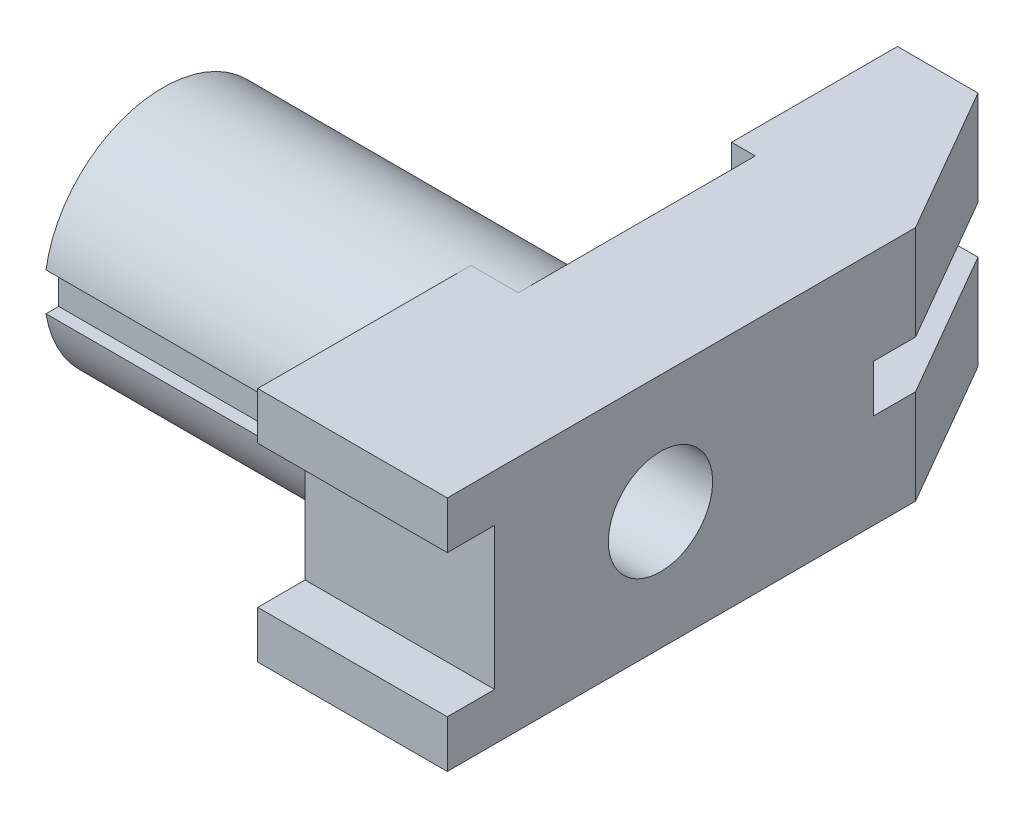
ISO-10303-21;
HEADER;
FILE_DESCRIPTION(('STEP AP214'),'2;1');
FILE_NAME('part.step','',(''),(''),'','','');
FILE_SCHEMA(('AUTOMOTIVE_DESIGN { 1 0 10303 214 1 1 1 1 }'));
ENDSEC;
DATA;
#1=APPLICATION_CONTEXT('core data for automotive mechanical design processes');
#2=APPLICATION_PROTOCOL_DEFINITION('international standard','automotive_design',2000,#1);
#3=PRODUCT_CONTEXT('',#1,'mechanical');
#4=PRODUCT('Part','Part','',(#3));
#5=PRODUCT_RELATED_PRODUCT_CATEGORY('part','',(#4));
#6=PRODUCT_DEFINITION_FORMATION('','',#4);
#7=PRODUCT_DEFINITION_CONTEXT('part definition',#1,'design');
#8=PRODUCT_DEFINITION('design','',#6,#7);
#9=PRODUCT_DEFINITION_SHAPE('','',#8);
#10=(LENGTH_UNIT() NAMED_UNIT(*) SI_UNIT(.MILLI.,.METRE.));
#11=(NAMED_UNIT(*) PLANE_ANGLE_UNIT() SI_UNIT($,.RADIAN.));
#12=(NAMED_UNIT(*) SI_UNIT($,.STERADIAN.) SOLID_ANGLE_UNIT());
#13=UNCERTAINTY_MEASURE_WITH_UNIT(LENGTH_MEASURE(1.E-05),#10,'distance_accuracy_value','');
#14=(GEOMETRIC_REPRESENTATION_CONTEXT(3) GLOBAL_UNCERTAINTY_ASSIGNED_CONTEXT((#13)) GLOBAL_UNIT_ASSIGNED_CONTEXT((#10,
#11,#12)) REPRESENTATION_CONTEXT('',''));
#15=CARTESIAN_POINT('',(0.,0.,0.));
#16=DIRECTION('',(0.,0.,1.));
#17=DIRECTION('',(1.,0.,0.));
#18=AXIS2_PLACEMENT_3D('',#15,#16,#17);
#19=CARTESIAN_POINT('',(-105.,25.0000000000001,-70.));
#20=DIRECTION('',(1.,0.,0.));
#21=DIRECTION('',(0.,0.,-1.));
#22=AXIS2_PLACEMENT_3D('',#19,#20,#21);
#23=PLANE('',#22);
#24=CARTESIAN_POINT('',(-105.,0.,-45.));
#25=DIRECTION('',(-1.,0.,0.));
#26=DIRECTION('',(0.,0.,1.));
#27=AXIS2_PLACEMENT_3D('',#24,#25,#26);
#28=CIRCLE('',#27,18.);
#29=CARTESIAN_POINT('',(-105.,0.,-27.));
#30=VERTEX_POINT('',#29);
#31=EDGE_CURVE('E785',#30,#30,#28,.T.);
#32=ORIENTED_EDGE('',*,*,#31,.F.);
#33=EDGE_LOOP('',(#32));
#34=FACE_BOUND('',#33,.T.);
#35=DIRECTION('',(0.,0.,-1.));
#36=VECTOR('',#35,1.);
#37=CARTESIAN_POINT('',(-105.,-4.00000000000001,0.));
#38=LINE('',#37,#36);
#39=CARTESIAN_POINT('',(-105.,-4.00000000000001,-20.3220746414939));
#40=VERTEX_POINT('',#39);
#41=CARTESIAN_POINT('',(-105.,-4.00000000000001,-23.));
#42=VERTEX_POINT('',#41);
#43=EDGE_CURVE('E248',#40,#42,#38,.T.);
#44=ORIENTED_EDGE('',*,*,#43,.T.);
#45=DIRECTION('',(0.,1.,0.));
#46=VECTOR('',#45,1.);
#47=CARTESIAN_POINT('',(-105.,-4.00000000000001,-23.));
#48=LINE('',#47,#46);
#49=CARTESIAN_POINT('',(-105.,4.00000000000001,-23.));
#50=VERTEX_POINT('',#49);
#51=EDGE_CURVE('E247',#42,#50,#48,.T.);
#52=ORIENTED_EDGE('',*,*,#51,.T.);
#53=DIRECTION('',(0.,0.,-1.));
#54=VECTOR('',#53,1.);
#55=CARTESIAN_POINT('',(-105.,4.00000000000001,0.));
#56=LINE('',#55,#54);
#57=CARTESIAN_POINT('',(-105.,4.00000000000001,-20.3220746414939));
#58=VERTEX_POINT('',#57);
#59=EDGE_CURVE('E239',#58,#50,#56,.T.);
#60=ORIENTED_EDGE('',*,*,#59,.F.);
#61=CARTESIAN_POINT('',(-105.,0.,-45.));
#62=DIRECTION('',(-1.,0.,0.));
#63=DIRECTION('',(0.,0.,1.));
#64=AXIS2_PLACEMENT_3D('',#61,#62,#63);
#65=CIRCLE('',#64,25.);
#66=EDGE_CURVE('E262',#58,#40,#65,.T.);
#67=ORIENTED_EDGE('',*,*,#66,.T.);
#68=EDGE_LOOP('',(#44,#52,#60,#67));
#69=FACE_BOUND('',#68,.T.);
#70=ADVANCED_FACE('F70',(#34,#69),#23,.F.);
#71=CARTESIAN_POINT('',(-30.,0.,-45.));
#72=DIRECTION('',(-1.,0.,0.));
#73=DIRECTION('',(0.,0.,1.));
#74=AXIS2_PLACEMENT_3D('',#71,#72,#73);
#75=CYLINDRICAL_SURFACE('',#74,25.);
#76=CARTESIAN_POINT('',(-40.,0.,-45.));
#77=DIRECTION('',(-1.,0.,0.));
#78=DIRECTION('',(0.,0.,1.));
#79=AXIS2_PLACEMENT_3D('',#76,#77,#78);
#80=CIRCLE('',#79,25.);
#81=CARTESIAN_POINT('',(-40.,-25.0000000000001,-45.));
#82=VERTEX_POINT('',#81);
#83=CARTESIAN_POINT('',(-40.,25.0000000000001,-45.));
#84=VERTEX_POINT('',#83);
#85=EDGE_CURVE('E252',#82,#84,#80,.T.);
#86=ORIENTED_EDGE('',*,*,#85,.T.);
#87=DIRECTION('',(-1.,0.,0.));
#88=VECTOR('',#87,1.);
#89=CARTESIAN_POINT('',(-30.,25.0000000000001,-45.));
#90=LINE('',#89,#88);
#91=CARTESIAN_POINT('',(-30.,25.0000000000001,-45.));
#92=VERTEX_POINT('',#91);
#93=EDGE_CURVE('E259',#92,#84,#90,.T.);
#94=ORIENTED_EDGE('',*,*,#93,.F.);
#95=CARTESIAN_POINT('',(-30.,0.,-45.));
#96=DIRECTION('',(-1.,0.,0.));
#97=DIRECTION('',(0.,0.,1.));
#98=AXIS2_PLACEMENT_3D('',#95,#96,#97);
#99=CIRCLE('',#98,25.);
#100=CARTESIAN_POINT('',(-30.,-25.0000000000001,-45.));
#101=VERTEX_POINT('',#100);
#102=EDGE_CURVE('E263',#92,#101,#99,.T.);
#103=ORIENTED_EDGE('',*,*,#102,.T.);
#104=DIRECTION('',(-1.,0.,0.));
#105=VECTOR('',#104,1.);
#106=CARTESIAN_POINT('',(-30.,-25.0000000000001,-45.));
#107=LINE('',#106,#105);
#108=EDGE_CURVE('E266',#101,#82,#107,.T.);
#109=ORIENTED_EDGE('',*,*,#108,.T.);
#110=EDGE_LOOP('',(#86,#94,#103,#109));
#111=FACE_BOUND('',#110,.T.);
#112=CARTESIAN_POINT('',(-48.1891833863778,-4.00000000000001,-20.3220746414939));
#113=CARTESIAN_POINT('',(-48.153061047939,-3.79263472747698,-20.2884587504304));
#114=CARTESIAN_POINT('',(-48.1201668566307,-3.58430736478111,-20.2573780464081));
#115=CARTESIAN_POINT('',(-48.0605427771464,-3.16608452499109,-20.2003954256627));
#116=CARTESIAN_POINT('',(-48.0338123857564,-2.95618917735305,-20.1744930861997));
#117=CARTESIAN_POINT('',(-47.9862181729804,-2.53515300017993,-20.1279701429585));
#118=CARTESIAN_POINT('',(-47.9653543363235,-2.32401217388836,-20.1073495254317));
#119=CARTESIAN_POINT('',(-47.9292800029746,-1.90080143650091,-20.0714607059728));
#120=CARTESIAN_POINT('',(-47.9140696500622,-1.68873150191466,-20.0561926401675));
#121=CARTESIAN_POINT('',(-47.8770690069398,-1.05850640747543,-20.018914778113));
#122=CARTESIAN_POINT('',(-47.8631393055396,-0.639374265330873,-20.0046630826135));
#123=CARTESIAN_POINT('',(-47.8559041205962,0.199104322464576,-19.9972753316197));
#124=CARTESIAN_POINT('',(-47.8625950258473,0.618450717734509,-20.0041355788739));
#125=CARTESIAN_POINT('',(-47.9000419624336,1.53337433769471,-20.0421295341584));
#126=CARTESIAN_POINT('',(-47.9350410788579,2.02862851604135,-20.0775392085342));
#127=CARTESIAN_POINT('',(-48.0113080321655,2.769148940734,-20.1525797385717));
#128=CARTESIAN_POINT('',(-48.0408958018128,3.01680138208284,-20.1814435177569));
#129=CARTESIAN_POINT('',(-48.108555481816,3.51006893435837,-20.2463872348163));
#130=CARTESIAN_POINT('',(-48.1466300161683,3.75568339075267,-20.2824694041676));
#131=CARTESIAN_POINT('',(-48.1891833863777,4.00000000000001,-20.3220746414939));
#132=B_SPLINE_CURVE_WITH_KNOTS('',3,(#112,#113,#114,#115,#116,#117,#118,#119,#120,#121,#122,
#123,#124,#125,#126,#127,#128,#129,#130,#131),.UNSPECIFIED.,.F.,.F.,(4,2,2,2,2,2,2,2,2,4),(0.,
0.639407778744696,1.27876333759013,1.9181172321481,2.55748738567127,3.81513840207781,
5.0725691835372,6.56379177154527,7.31680844559122,8.07005826627208),.UNSPECIFIED.);
#133=CARTESIAN_POINT('',(-48.1891833863778,-4.00000000000001,-20.3220746414939));
#134=VERTEX_POINT('',#133);
#135=CARTESIAN_POINT('',(-48.1891833863778,4.00000000000001,-20.3220746414939));
#136=VERTEX_POINT('',#135);
#137=EDGE_CURVE('E78',#134,#136,#132,.T.);
#138=ORIENTED_EDGE('',*,*,#137,.F.);
#139=DIRECTION('',(-1.,0.,0.));
#140=VECTOR('',#139,1.);
#141=CARTESIAN_POINT('',(-29.9999999999999,-4.00000000000001,-20.3220746414939));
#142=LINE('',#141,#140);
#143=EDGE_CURVE('E12',#134,#40,#142,.T.);
#144=ORIENTED_EDGE('',*,*,#143,.T.);
#145=ORIENTED_EDGE('',*,*,#66,.F.);
#146=DIRECTION('',(-1.,0.,0.));
#147=VECTOR('',#146,1.);
#148=CARTESIAN_POINT('',(-29.9999999999999,4.00000000000001,-20.3220746414939));
#149=LINE('',#148,#147);
#150=EDGE_CURVE('E398',#136,#58,#149,.T.);
#151=ORIENTED_EDGE('',*,*,#150,.F.);
#152=EDGE_LOOP('',(#138,#144,#145,#151));
#153=FACE_BOUND('',#152,.T.);
#154=ADVANCED_FACE('F404',(#111,#153),#75,.T.);
#155=CARTESIAN_POINT('',(0.,25.0000000000001,0.));
#156=DIRECTION('',(0.,1.,0.));
#157=DIRECTION('',(0.,0.,1.));
#158=AXIS2_PLACEMENT_3D('',#155,#156,#157);
#159=PLANE('',#158);
#160=ORIENTED_EDGE('',*,*,#93,.T.);
#161=DIRECTION('',(0.,0.,1.));
#162=VECTOR('',#161,1.);
#163=CARTESIAN_POINT('',(-40.,25.0000000000001,-20.));
#164=LINE('',#163,#162);
#165=CARTESIAN_POINT('',(-40.,25.0000000000001,0.));
#166=VERTEX_POINT('',#165);
#167=EDGE_CURVE('E347',#84,#166,#164,.T.);
#168=ORIENTED_EDGE('',*,*,#167,.T.);
#169=DIRECTION('',(1.,0.,0.));
#170=VECTOR('',#169,1.);
#171=CARTESIAN_POINT('',(-40.,25.0000000000001,0.));
#172=LINE('',#171,#170);
#173=CARTESIAN_POINT('',(0.,25.0000000000001,0.));
#174=VERTEX_POINT('',#173);
#175=EDGE_CURVE('E331',#166,#174,#172,.T.);
#176=ORIENTED_EDGE('',*,*,#175,.T.);
#177=DIRECTION('',(0.,0.,-1.));
#178=VECTOR('',#177,1.);
#179=CARTESIAN_POINT('',(0.,25.0000000000001,0.));
#180=LINE('',#179,#178);
#181=CARTESIAN_POINT('',(0.,25.0000000000001,-98.8230854637603));
#182=VERTEX_POINT('',#181);
#183=EDGE_CURVE('E334',#174,#182,#180,.T.);
#184=ORIENTED_EDGE('',*,*,#183,.T.);
#185=DIRECTION('',(-0.500000000000001,0.,-0.866025403784438));
#186=VECTOR('',#185,1.);
#187=CARTESIAN_POINT('',(0.,25.0000000000001,-98.8230854637603));
#188=LINE('',#187,#186);
#189=CARTESIAN_POINT('',(-18.,25.0000000000001,-130.));
#190=VERTEX_POINT('',#189);
#191=EDGE_CURVE('E337',#182,#190,#188,.T.);
#192=ORIENTED_EDGE('',*,*,#191,.T.);
#193=DIRECTION('',(-1.,0.,0.));
#194=VECTOR('',#193,1.);
#195=CARTESIAN_POINT('',(-18.,25.0000000000001,-130.));
#196=LINE('',#195,#194);
#197=CARTESIAN_POINT('',(-35.,25.0000000000001,-130.));
#198=VERTEX_POINT('',#197);
#199=EDGE_CURVE('E339',#190,#198,#196,.T.);
#200=ORIENTED_EDGE('',*,*,#199,.T.);
#201=DIRECTION('',(0.,0.,1.));
#202=VECTOR('',#201,1.);
#203=CARTESIAN_POINT('',(-35.,25.0000000000001,-130.));
#204=LINE('',#203,#202);
#205=CARTESIAN_POINT('',(-35.,25.0000000000001,-95.));
#206=VERTEX_POINT('',#205);
#207=EDGE_CURVE('E341',#198,#206,#204,.T.);
#208=ORIENTED_EDGE('',*,*,#207,.T.);
#209=DIRECTION('',(1.,0.,0.));
#210=VECTOR('',#209,1.);
#211=CARTESIAN_POINT('',(-35.,25.0000000000001,-95.));
#212=LINE('',#211,#210);
#213=CARTESIAN_POINT('',(-30.,25.0000000000001,-95.0000000000001));
#214=VERTEX_POINT('',#213);
#215=EDGE_CURVE('E343',#206,#214,#212,.T.);
#216=ORIENTED_EDGE('',*,*,#215,.T.);
#217=DIRECTION('',(0.,0.,1.));
#218=VECTOR('',#217,1.);
#219=CARTESIAN_POINT('',(-30.,25.0000000000001,-95.0000000000001));
#220=LINE('',#219,#218);
#221=EDGE_CURVE('E345',#214,#92,#220,.T.);
#222=ORIENTED_EDGE('',*,*,#221,.T.);
#223=EDGE_LOOP('',(#160,#168,#176,#184,#192,#200,#208,#216,#222));
#224=FACE_BOUND('',#223,.T.);
#225=ADVANCED_FACE('F439',(#224),#159,.T.);
#226=CARTESIAN_POINT('',(0.,-25.0000000000001,0.));
#227=DIRECTION('',(0.,1.,0.));
#228=DIRECTION('',(0.,0.,1.));
#229=AXIS2_PLACEMENT_3D('',#226,#227,#228);
#230=PLANE('',#229);
#231=DIRECTION('',(0.,0.,1.));
#232=VECTOR('',#231,1.);
#233=CARTESIAN_POINT('',(-40.,-25.0000000000001,-20.));
#234=LINE('',#233,#232);
#235=CARTESIAN_POINT('',(-40.,-25.0000000000001,0.));
#236=VERTEX_POINT('',#235);
#237=EDGE_CURVE('E335',#82,#236,#234,.T.);
#238=ORIENTED_EDGE('',*,*,#237,.F.);
#239=ORIENTED_EDGE('',*,*,#108,.F.);
#240=DIRECTION('',(0.,0.,1.));
#241=VECTOR('',#240,1.);
#242=CARTESIAN_POINT('',(-30.,-25.0000000000001,-89.5244773048154));
#243=LINE('',#242,#241);
#244=CARTESIAN_POINT('',(-30.,-25.0000000000001,-95.0000000000001));
#245=VERTEX_POINT('',#244);
#246=EDGE_CURVE('E367',#245,#101,#243,.T.);
#247=ORIENTED_EDGE('',*,*,#246,.F.);
#248=DIRECTION('',(1.,0.,0.));
#249=VECTOR('',#248,1.);
#250=CARTESIAN_POINT('',(-35.,-25.0000000000001,-95.));
#251=LINE('',#250,#249);
#252=CARTESIAN_POINT('',(-35.,-25.0000000000001,-95.));
#253=VERTEX_POINT('',#252);
#254=EDGE_CURVE('E364',#253,#245,#251,.T.);
#255=ORIENTED_EDGE('',*,*,#254,.F.);
#256=DIRECTION('',(0.,0.,1.));
#257=VECTOR('',#256,1.);
#258=CARTESIAN_POINT('',(-35.,-25.0000000000001,-130.));
#259=LINE('',#258,#257);
#260=CARTESIAN_POINT('',(-35.,-25.0000000000001,-130.));
#261=VERTEX_POINT('',#260);
#262=EDGE_CURVE('E361',#261,#253,#259,.T.);
#263=ORIENTED_EDGE('',*,*,#262,.F.);
#264=DIRECTION('',(-1.,0.,0.));
#265=VECTOR('',#264,1.);
#266=CARTESIAN_POINT('',(-18.,-25.0000000000001,-130.));
#267=LINE('',#266,#265);
#268=CARTESIAN_POINT('',(-18.,-25.0000000000001,-130.));
#269=VERTEX_POINT('',#268);
#270=EDGE_CURVE('E358',#269,#261,#267,.T.);
#271=ORIENTED_EDGE('',*,*,#270,.F.);
#272=DIRECTION('',(-0.500000000000001,0.,-0.866025403784438));
#273=VECTOR('',#272,1.);
#274=CARTESIAN_POINT('',(0.,-25.0000000000001,-98.8230854637603));
#275=LINE('',#274,#273);
#276=CARTESIAN_POINT('',(0.,-25.0000000000001,-98.8230854637603));
#277=VERTEX_POINT('',#276);
#278=EDGE_CURVE('E355',#277,#269,#275,.T.);
#279=ORIENTED_EDGE('',*,*,#278,.F.);
#280=DIRECTION('',(0.,0.,-1.));
#281=VECTOR('',#280,1.);
#282=CARTESIAN_POINT('',(0.,-25.0000000000001,0.));
#283=LINE('',#282,#281);
#284=CARTESIAN_POINT('',(0.,-25.0000000000001,0.));
#285=VERTEX_POINT('',#284);
#286=EDGE_CURVE('E352',#285,#277,#283,.T.);
#287=ORIENTED_EDGE('',*,*,#286,.F.);
#288=DIRECTION('',(1.,0.,0.));
#289=VECTOR('',#288,1.);
#290=CARTESIAN_POINT('',(-40.,-25.0000000000001,0.));
#291=LINE('',#290,#289);
#292=EDGE_CURVE('E330',#236,#285,#291,.T.);
#293=ORIENTED_EDGE('',*,*,#292,.F.);
#294=EDGE_LOOP('',(#238,#239,#247,#255,#263,#271,#279,#287,#293));
#295=FACE_BOUND('',#294,.T.);
#296=ADVANCED_FACE('F504',(#295),#230,.F.);
#297=CARTESIAN_POINT('',(-40.,25.0000000000001,0.));
#298=DIRECTION('',(0.,0.,-1.));
#299=DIRECTION('',(-1.,0.,0.));
#300=AXIS2_PLACEMENT_3D('',#297,#298,#299);
#301=PLANE('',#300);
#302=DIRECTION('',(0.,-1.,0.));
#303=VECTOR('',#302,1.);
#304=CARTESIAN_POINT('',(-40.,25.0000000000001,0.));
#305=LINE('',#304,#303);
#306=CARTESIAN_POINT('',(-40.,15.0000000000001,0.));
#307=VERTEX_POINT('',#306);
#308=EDGE_CURVE('E371',#166,#307,#305,.T.);
#309=ORIENTED_EDGE('',*,*,#308,.T.);
#310=DIRECTION('',(1.,0.,0.));
#311=VECTOR('',#310,1.);
#312=CARTESIAN_POINT('',(-105.001,15.0000000000001,0.));
#313=LINE('',#312,#311);
#314=CARTESIAN_POINT('',(0.,15.,0.));
#315=VERTEX_POINT('',#314);
#316=EDGE_CURVE('E284',#307,#315,#313,.T.);
#317=ORIENTED_EDGE('',*,*,#316,.T.);
#318=DIRECTION('',(0.,-1.,0.));
#319=VECTOR('',#318,1.);
#320=CARTESIAN_POINT('',(0.,25.0000000000001,0.));
#321=LINE('',#320,#319);
#322=EDGE_CURVE('E395',#174,#315,#321,.T.);
#323=ORIENTED_EDGE('',*,*,#322,.F.);
#324=ORIENTED_EDGE('',*,*,#175,.F.);
#325=EDGE_LOOP('',(#309,#317,#323,#324));
#326=FACE_BOUND('',#325,.T.);
#327=ADVANCED_FACE('F477',(#326),#301,.F.);
#328=CARTESIAN_POINT('',(0.,25.0000000000001,-98.8230854637603));
#329=DIRECTION('',(-0.866025403784438,0.,0.500000000000001));
#330=DIRECTION('',(0.500000000000001,0.,0.866025403784438));
#331=AXIS2_PLACEMENT_3D('',#328,#329,#330);
#332=PLANE('',#331);
#333=DIRECTION('',(0.,-1.,0.));
#334=VECTOR('',#333,1.);
#335=CARTESIAN_POINT('',(-18.,25.0000000000001,-130.));
#336=LINE('',#335,#334);
#337=CARTESIAN_POINT('',(-18.,-5.00000000000002,-130.));
#338=VERTEX_POINT('',#337);
#339=EDGE_CURVE('E386',#338,#269,#336,.T.);
#340=ORIENTED_EDGE('',*,*,#339,.F.);
#341=DIRECTION('',(-0.500000000000001,0.,-0.866025403784438));
#342=VECTOR('',#341,1.);
#343=CARTESIAN_POINT('',(-22.4297419243113,-5.00000000000001,-137.672538077325));
#344=LINE('',#343,#342);
#345=CARTESIAN_POINT('',(0.,-5.00000000000002,-98.8230854637603));
#346=VERTEX_POINT('',#345);
#347=EDGE_CURVE('E296',#346,#338,#344,.T.);
#348=ORIENTED_EDGE('',*,*,#347,.F.);
#349=DIRECTION('',(0.,-1.,0.));
#350=VECTOR('',#349,1.);
#351=CARTESIAN_POINT('',(0.,25.0000000000001,-98.8230854637603));
#352=LINE('',#351,#350);
#353=EDGE_CURVE('E390',#346,#277,#352,.T.);
#354=ORIENTED_EDGE('',*,*,#353,.T.);
#355=ORIENTED_EDGE('',*,*,#278,.T.);
#356=EDGE_LOOP('',(#340,#348,#354,#355));
#357=FACE_BOUND('',#356,.T.);
#358=ADVANCED_FACE('F470',(#357),#332,.F.);
#359=CARTESIAN_POINT('',(-18.,25.0000000000001,-130.));
#360=DIRECTION('',(0.,0.,1.));
#361=DIRECTION('',(1.,0.,0.));
#362=AXIS2_PLACEMENT_3D('',#359,#360,#361);
#363=PLANE('',#362);
#364=DIRECTION('',(0.,-1.,0.));
#365=VECTOR('',#364,1.);
#366=CARTESIAN_POINT('',(-35.,25.0000000000001,-130.));
#367=LINE('',#366,#365);
#368=CARTESIAN_POINT('',(-35.,-5.00000000000002,-130.));
#369=VERTEX_POINT('',#368);
#370=EDGE_CURVE('E382',#369,#261,#367,.T.);
#371=ORIENTED_EDGE('',*,*,#370,.F.);
#372=DIRECTION('',(1.,0.,0.));
#373=VECTOR('',#372,1.);
#374=CARTESIAN_POINT('',(-105.001,-5.00000000000001,-130.));
#375=LINE('',#374,#373);
#376=EDGE_CURVE('E316',#369,#338,#375,.T.);
#377=ORIENTED_EDGE('',*,*,#376,.T.);
#378=ORIENTED_EDGE('',*,*,#339,.T.);
#379=ORIENTED_EDGE('',*,*,#270,.T.);
#380=EDGE_LOOP('',(#371,#377,#378,#379));
#381=FACE_BOUND('',#380,.T.);
#382=ADVANCED_FACE('F466',(#381),#363,.F.);
#383=CARTESIAN_POINT('',(-35.,25.0000000000001,-130.));
#384=DIRECTION('',(1.,0.,0.));
#385=DIRECTION('',(0.,0.,-1.));
#386=AXIS2_PLACEMENT_3D('',#383,#384,#385);
#387=PLANE('',#386);
#388=DIRECTION('',(0.,-1.,0.));
#389=VECTOR('',#388,1.);
#390=CARTESIAN_POINT('',(-35.,25.0000000000001,-95.));
#391=LINE('',#390,#389);
#392=CARTESIAN_POINT('',(-35.,-5.00000000000002,-95.));
#393=VERTEX_POINT('',#392);
#394=EDGE_CURVE('E378',#393,#253,#391,.T.);
#395=ORIENTED_EDGE('',*,*,#394,.F.);
#396=DIRECTION('',(0.,0.,1.));
#397=VECTOR('',#396,1.);
#398=CARTESIAN_POINT('',(-35.,-5.00000000000002,-90.));
#399=LINE('',#398,#397);
#400=EDGE_CURVE('E305',#369,#393,#399,.T.);
#401=ORIENTED_EDGE('',*,*,#400,.F.);
#402=ORIENTED_EDGE('',*,*,#370,.T.);
#403=ORIENTED_EDGE('',*,*,#262,.T.);
#404=EDGE_LOOP('',(#395,#401,#402,#403));
#405=FACE_BOUND('',#404,.T.);
#406=ADVANCED_FACE('F461',(#405),#387,.F.);
#407=CARTESIAN_POINT('',(-35.,25.0000000000001,-95.));
#408=DIRECTION('',(0.,0.,-1.));
#409=DIRECTION('',(-1.,0.,0.));
#410=AXIS2_PLACEMENT_3D('',#407,#408,#409);
#411=PLANE('',#410);
#412=DIRECTION('',(0.,-1.,0.));
#413=VECTOR('',#412,1.);
#414=CARTESIAN_POINT('',(-30.,25.0000000000001,-95.0000000000001));
#415=LINE('',#414,#413);
#416=CARTESIAN_POINT('',(-30.,-5.00000000000001,-95.0000000000001));
#417=VERTEX_POINT('',#416);
#418=EDGE_CURVE('E374',#417,#245,#415,.T.);
#419=ORIENTED_EDGE('',*,*,#418,.F.);
#420=DIRECTION('',(1.,0.,0.));
#421=VECTOR('',#420,1.);
#422=CARTESIAN_POINT('',(-105.001,-5.00000000000001,-95.));
#423=LINE('',#422,#421);
#424=EDGE_CURVE('E303',#393,#417,#423,.T.);
#425=ORIENTED_EDGE('',*,*,#424,.F.);
#426=ORIENTED_EDGE('',*,*,#394,.T.);
#427=ORIENTED_EDGE('',*,*,#254,.T.);
#428=EDGE_LOOP('',(#419,#425,#426,#427));
#429=FACE_BOUND('',#428,.T.);
#430=ADVANCED_FACE('F456',(#429),#411,.F.);
#431=CARTESIAN_POINT('',(0.,-15.,0.));
#432=VERTEX_POINT('',#431);
#433=EDGE_CURVE('E394',#432,#285,#321,.T.);
#434=ORIENTED_EDGE('',*,*,#433,.F.);
#435=DIRECTION('',(1.,0.,0.));
#436=VECTOR('',#435,1.);
#437=CARTESIAN_POINT('',(-105.001,-15.,0.));
#438=LINE('',#437,#436);
#439=CARTESIAN_POINT('',(-40.,-15.,0.));
#440=VERTEX_POINT('',#439);
#441=EDGE_CURVE('E283',#440,#432,#438,.T.);
#442=ORIENTED_EDGE('',*,*,#441,.F.);
#443=EDGE_CURVE('E349',#440,#236,#305,.T.);
#444=ORIENTED_EDGE('',*,*,#443,.T.);
#445=ORIENTED_EDGE('',*,*,#292,.T.);
#446=EDGE_LOOP('',(#434,#442,#444,#445));
#447=FACE_BOUND('',#446,.T.);
#448=ADVANCED_FACE('F72',(#447),#301,.F.);
#449=CARTESIAN_POINT('',(0.,25.0000000000001,0.));
#450=DIRECTION('',(-1.,0.,0.));
#451=DIRECTION('',(0.,0.,1.));
#452=AXIS2_PLACEMENT_3D('',#449,#450,#451);
#453=PLANE('',#452);
#454=CARTESIAN_POINT('',(0.,0.,-45.));
#455=DIRECTION('',(-1.,0.,0.));
#456=DIRECTION('',(0.,0.,1.));
#457=AXIS2_PLACEMENT_3D('',#454,#455,#456);
#458=CIRCLE('',#457,11.);
#459=CARTESIAN_POINT('',(0.,0.,-34.));
#460=VERTEX_POINT('',#459);
#461=EDGE_CURVE('E481',#460,#460,#458,.F.);
#462=ORIENTED_EDGE('',*,*,#461,.F.);
#463=EDGE_LOOP('',(#462));
#464=FACE_BOUND('',#463,.T.);
#465=ORIENTED_EDGE('',*,*,#322,.T.);
#466=DIRECTION('',(0.,0.,1.));
#467=VECTOR('',#466,1.);
#468=CARTESIAN_POINT('',(0.,15.0000000000001,-10.));
#469=LINE('',#468,#467);
#470=CARTESIAN_POINT('',(0.,15.0000000000001,-10.));
#471=VERTEX_POINT('',#470);
#472=EDGE_CURVE('E281',#471,#315,#469,.T.);
#473=ORIENTED_EDGE('',*,*,#472,.F.);
#474=DIRECTION('',(0.,1.,0.));
#475=VECTOR('',#474,1.);
#476=CARTESIAN_POINT('',(0.,15.0000000000001,-10.));
#477=LINE('',#476,#475);
#478=CARTESIAN_POINT('',(0.,-15.,-10.));
#479=VERTEX_POINT('',#478);
#480=EDGE_CURVE('E278',#479,#471,#477,.T.);
#481=ORIENTED_EDGE('',*,*,#480,.F.);
#482=DIRECTION('',(0.,0.,-1.));
#483=VECTOR('',#482,1.);
#484=CARTESIAN_POINT('',(0.,-15.,-10.));
#485=LINE('',#484,#483);
#486=EDGE_CURVE('E275',#432,#479,#485,.T.);
#487=ORIENTED_EDGE('',*,*,#486,.F.);
#488=ORIENTED_EDGE('',*,*,#433,.T.);
#489=ORIENTED_EDGE('',*,*,#286,.T.);
#490=ORIENTED_EDGE('',*,*,#353,.F.);
#491=DIRECTION('',(0.,0.,-1.));
#492=VECTOR('',#491,1.);
#493=CARTESIAN_POINT('',(0.,-5.00000000000002,-90.));
#494=LINE('',#493,#492);
#495=CARTESIAN_POINT('',(0.,-5.00000000000002,-90.));
#496=VERTEX_POINT('',#495);
#497=EDGE_CURVE('E313',#496,#346,#494,.T.);
#498=ORIENTED_EDGE('',*,*,#497,.F.);
#499=DIRECTION('',(0.,-1.,0.));
#500=VECTOR('',#499,1.);
#501=CARTESIAN_POINT('',(0.,5.,-90.));
#502=LINE('',#501,#500);
#503=CARTESIAN_POINT('',(0.,5.,-90.));
#504=VERTEX_POINT('',#503);
#505=EDGE_CURVE('E310',#504,#496,#502,.T.);
#506=ORIENTED_EDGE('',*,*,#505,.F.);
#507=DIRECTION('',(0.,0.,1.));
#508=VECTOR('',#507,1.);
#509=CARTESIAN_POINT('',(0.,5.,-90.));
#510=LINE('',#509,#508);
#511=CARTESIAN_POINT('',(0.,5.00000000000001,-98.8230854637603));
#512=VERTEX_POINT('',#511);
#513=EDGE_CURVE('E307',#512,#504,#510,.T.);
#514=ORIENTED_EDGE('',*,*,#513,.F.);
#515=EDGE_CURVE('E391',#182,#512,#352,.T.);
#516=ORIENTED_EDGE('',*,*,#515,.F.);
#517=ORIENTED_EDGE('',*,*,#183,.F.);
#518=EDGE_LOOP('',(#465,#473,#481,#487,#488,#489,#490,#498,#506,#514,#516,#517));
#519=FACE_BOUND('',#518,.T.);
#520=ADVANCED_FACE('F468',(#464,#519),#453,.F.);
#521=ORIENTED_EDGE('',*,*,#515,.T.);
#522=DIRECTION('',(0.500000000000001,0.,0.866025403784438));
#523=VECTOR('',#522,1.);
#524=CARTESIAN_POINT('',(-22.4297419243113,5.00000000000002,-137.672538077325));
#525=LINE('',#524,#523);
#526=CARTESIAN_POINT('',(-18.,5.00000000000001,-130.));
#527=VERTEX_POINT('',#526);
#528=EDGE_CURVE('E294',#527,#512,#525,.T.);
#529=ORIENTED_EDGE('',*,*,#528,.F.);
#530=EDGE_CURVE('E387',#190,#527,#336,.T.);
#531=ORIENTED_EDGE('',*,*,#530,.F.);
#532=ORIENTED_EDGE('',*,*,#191,.F.);
#533=EDGE_LOOP('',(#521,#529,#531,#532));
#534=FACE_BOUND('',#533,.T.);
#535=ADVANCED_FACE('F464',(#534),#332,.F.);
#536=ORIENTED_EDGE('',*,*,#530,.T.);
#537=DIRECTION('',(1.,0.,0.));
#538=VECTOR('',#537,1.);
#539=CARTESIAN_POINT('',(-105.001,5.00000000000002,-130.));
#540=LINE('',#539,#538);
#541=CARTESIAN_POINT('',(-35.,5.00000000000002,-130.));
#542=VERTEX_POINT('',#541);
#543=EDGE_CURVE('E315',#542,#527,#540,.T.);
#544=ORIENTED_EDGE('',*,*,#543,.F.);
#545=EDGE_CURVE('E383',#198,#542,#367,.T.);
#546=ORIENTED_EDGE('',*,*,#545,.F.);
#547=ORIENTED_EDGE('',*,*,#199,.F.);
#548=EDGE_LOOP('',(#536,#544,#546,#547));
#549=FACE_BOUND('',#548,.T.);
#550=ADVANCED_FACE('F459',(#549),#363,.F.);
#551=ORIENTED_EDGE('',*,*,#545,.T.);
#552=DIRECTION('',(0.,0.,-1.));
#553=VECTOR('',#552,1.);
#554=CARTESIAN_POINT('',(-35.,5.,-90.));
#555=LINE('',#554,#553);
#556=CARTESIAN_POINT('',(-35.,5.,-95.));
#557=VERTEX_POINT('',#556);
#558=EDGE_CURVE('E328',#557,#542,#555,.T.);
#559=ORIENTED_EDGE('',*,*,#558,.F.);
#560=EDGE_CURVE('E379',#206,#557,#391,.T.);
#561=ORIENTED_EDGE('',*,*,#560,.F.);
#562=ORIENTED_EDGE('',*,*,#207,.F.);
#563=EDGE_LOOP('',(#551,#559,#561,#562));
#564=FACE_BOUND('',#563,.T.);
#565=ADVANCED_FACE('F454',(#564),#387,.F.);
#566=ORIENTED_EDGE('',*,*,#560,.T.);
#567=DIRECTION('',(-1.,0.,0.));
#568=VECTOR('',#567,1.);
#569=CARTESIAN_POINT('',(-105.001,5.,-95.));
#570=LINE('',#569,#568);
#571=CARTESIAN_POINT('',(-30.,5.,-95.0000000000001));
#572=VERTEX_POINT('',#571);
#573=EDGE_CURVE('E326',#572,#557,#570,.T.);
#574=ORIENTED_EDGE('',*,*,#573,.F.);
#575=EDGE_CURVE('E375',#214,#572,#415,.T.);
#576=ORIENTED_EDGE('',*,*,#575,.F.);
#577=ORIENTED_EDGE('',*,*,#215,.F.);
#578=EDGE_LOOP('',(#566,#574,#576,#577));
#579=FACE_BOUND('',#578,.T.);
#580=ADVANCED_FACE('F450',(#579),#411,.F.);
#581=CARTESIAN_POINT('',(-29.9999999999999,25.0000000000001,-89.5244773048155));
#582=DIRECTION('',(1.,0.,0.));
#583=DIRECTION('',(0.,0.,-1.));
#584=AXIS2_PLACEMENT_3D('',#581,#582,#583);
#585=PLANE('',#584);
#586=DIRECTION('',(0.,1.,0.));
#587=VECTOR('',#586,1.);
#588=CARTESIAN_POINT('',(-30.,5.,-90.0000000000001));
#589=LINE('',#588,#587);
#590=CARTESIAN_POINT('',(-30.,-5.00000000000001,-90.0000000000001));
#591=VERTEX_POINT('',#590);
#592=CARTESIAN_POINT('',(-30.,5.,-90.0000000000001));
#593=VERTEX_POINT('',#592);
#594=EDGE_CURVE('E298',#591,#593,#589,.T.);
#595=ORIENTED_EDGE('',*,*,#594,.F.);
#596=DIRECTION('',(0.,0.,1.));
#597=VECTOR('',#596,1.);
#598=CARTESIAN_POINT('',(-30.,-5.00000000000001,-90.0000000000001));
#599=LINE('',#598,#597);
#600=EDGE_CURVE('E300',#417,#591,#599,.T.);
#601=ORIENTED_EDGE('',*,*,#600,.F.);
#602=ORIENTED_EDGE('',*,*,#418,.T.);
#603=ORIENTED_EDGE('',*,*,#246,.T.);
#604=ORIENTED_EDGE('',*,*,#102,.F.);
#605=ORIENTED_EDGE('',*,*,#221,.F.);
#606=ORIENTED_EDGE('',*,*,#575,.T.);
#607=DIRECTION('',(0.,0.,-1.));
#608=VECTOR('',#607,1.);
#609=CARTESIAN_POINT('',(-30.,5.,-90.0000000000001));
#610=LINE('',#609,#608);
#611=EDGE_CURVE('E319',#593,#572,#610,.T.);
#612=ORIENTED_EDGE('',*,*,#611,.F.);
#613=EDGE_LOOP('',(#595,#601,#602,#603,#604,#605,#606,#612));
#614=FACE_BOUND('',#613,.T.);
#615=ADVANCED_FACE('F447',(#614),#585,.F.);
#616=CARTESIAN_POINT('',(-40.,25.0000000000001,-20.));
#617=DIRECTION('',(1.,0.,0.));
#618=DIRECTION('',(0.,0.,-1.));
#619=AXIS2_PLACEMENT_3D('',#616,#617,#618);
#620=PLANE('',#619);
#621=DIRECTION('',(0.,-1.,0.));
#622=VECTOR('',#621,1.);
#623=CARTESIAN_POINT('',(-40.,15.0000000000001,-10.));
#624=LINE('',#623,#622);
#625=CARTESIAN_POINT('',(-40.,15.0000000000001,-10.));
#626=VERTEX_POINT('',#625);
#627=CARTESIAN_POINT('',(-40.,-15.,-10.));
#628=VERTEX_POINT('',#627);
#629=EDGE_CURVE('E93',#626,#628,#624,.T.);
#630=ORIENTED_EDGE('',*,*,#629,.F.);
#631=DIRECTION('',(0.,0.,-1.));
#632=VECTOR('',#631,1.);
#633=CARTESIAN_POINT('',(-40.,15.0000000000001,-10.));
#634=LINE('',#633,#632);
#635=EDGE_CURVE('E272',#307,#626,#634,.T.);
#636=ORIENTED_EDGE('',*,*,#635,.F.);
#637=ORIENTED_EDGE('',*,*,#308,.F.);
#638=ORIENTED_EDGE('',*,*,#167,.F.);
#639=ORIENTED_EDGE('',*,*,#85,.F.);
#640=ORIENTED_EDGE('',*,*,#237,.T.);
#641=ORIENTED_EDGE('',*,*,#443,.F.);
#642=DIRECTION('',(0.,0.,1.));
#643=VECTOR('',#642,1.);
#644=CARTESIAN_POINT('',(-40.,-15.,-10.));
#645=LINE('',#644,#643);
#646=EDGE_CURVE('E287',#628,#440,#645,.T.);
#647=ORIENTED_EDGE('',*,*,#646,.F.);
#648=EDGE_LOOP('',(#630,#636,#637,#638,#639,#640,#641,#647));
#649=FACE_BOUND('',#648,.T.);
#650=ADVANCED_FACE('F445',(#649),#620,.F.);
#651=CARTESIAN_POINT('',(-105.001,-5.00000000000001,-90.));
#652=DIRECTION('',(0.,-1.,0.));
#653=DIRECTION('',(0.,0.,-1.));
#654=AXIS2_PLACEMENT_3D('',#651,#652,#653);
#655=PLANE('',#654);
#656=ORIENTED_EDGE('',*,*,#347,.T.);
#657=ORIENTED_EDGE('',*,*,#376,.F.);
#658=ORIENTED_EDGE('',*,*,#400,.T.);
#659=ORIENTED_EDGE('',*,*,#424,.T.);
#660=ORIENTED_EDGE('',*,*,#600,.T.);
#661=DIRECTION('',(1.,0.,0.));
#662=VECTOR('',#661,1.);
#663=CARTESIAN_POINT('',(-105.001,-5.00000000000001,-90.));
#664=LINE('',#663,#662);
#665=EDGE_CURVE('E320',#591,#496,#664,.T.);
#666=ORIENTED_EDGE('',*,*,#665,.T.);
#667=ORIENTED_EDGE('',*,*,#497,.T.);
#668=EDGE_LOOP('',(#656,#657,#658,#659,#660,#666,#667));
#669=FACE_BOUND('',#668,.T.);
#670=ADVANCED_FACE('F514',(#669),#655,.F.);
#671=CARTESIAN_POINT('',(-105.001,5.,-90.));
#672=DIRECTION('',(0.,0.,1.));
#673=DIRECTION('',(1.,0.,0.));
#674=AXIS2_PLACEMENT_3D('',#671,#672,#673);
#675=PLANE('',#674);
#676=ORIENTED_EDGE('',*,*,#594,.T.);
#677=DIRECTION('',(1.,0.,0.));
#678=VECTOR('',#677,1.);
#679=CARTESIAN_POINT('',(-105.001,5.,-90.));
#680=LINE('',#679,#678);
#681=EDGE_CURVE('E322',#593,#504,#680,.T.);
#682=ORIENTED_EDGE('',*,*,#681,.T.);
#683=ORIENTED_EDGE('',*,*,#505,.T.);
#684=ORIENTED_EDGE('',*,*,#665,.F.);
#685=EDGE_LOOP('',(#676,#682,#683,#684));
#686=FACE_BOUND('',#685,.T.);
#687=ADVANCED_FACE('F518',(#686),#675,.F.);
#688=CARTESIAN_POINT('',(-105.001,5.,-90.));
#689=DIRECTION('',(0.,1.,0.));
#690=DIRECTION('',(0.,0.,1.));
#691=AXIS2_PLACEMENT_3D('',#688,#689,#690);
#692=PLANE('',#691);
#693=ORIENTED_EDGE('',*,*,#528,.T.);
#694=ORIENTED_EDGE('',*,*,#513,.T.);
#695=ORIENTED_EDGE('',*,*,#681,.F.);
#696=ORIENTED_EDGE('',*,*,#611,.T.);
#697=ORIENTED_EDGE('',*,*,#573,.T.);
#698=ORIENTED_EDGE('',*,*,#558,.T.);
#699=ORIENTED_EDGE('',*,*,#543,.T.);
#700=EDGE_LOOP('',(#693,#694,#695,#696,#697,#698,#699));
#701=FACE_BOUND('',#700,.T.);
#702=ADVANCED_FACE('F522',(#701),#692,.F.);
#703=CARTESIAN_POINT('',(-105.001,15.0000000000001,-10.));
#704=DIRECTION('',(0.,1.,0.));
#705=DIRECTION('',(0.,0.,1.));
#706=AXIS2_PLACEMENT_3D('',#703,#704,#705);
#707=PLANE('',#706);
#708=ORIENTED_EDGE('',*,*,#635,.T.);
#709=DIRECTION('',(1.,0.,0.));
#710=VECTOR('',#709,1.);
#711=CARTESIAN_POINT('',(-105.001,15.0000000000001,-10.));
#712=LINE('',#711,#710);
#713=EDGE_CURVE('E288',#626,#471,#712,.T.);
#714=ORIENTED_EDGE('',*,*,#713,.T.);
#715=ORIENTED_EDGE('',*,*,#472,.T.);
#716=ORIENTED_EDGE('',*,*,#316,.F.);
#717=EDGE_LOOP('',(#708,#714,#715,#716));
#718=FACE_BOUND('',#717,.T.);
#719=ADVANCED_FACE('F491',(#718),#707,.F.);
#720=CARTESIAN_POINT('',(-105.001,15.0000000000001,-10.));
#721=DIRECTION('',(0.,0.,-1.));
#722=DIRECTION('',(-1.,0.,0.));
#723=AXIS2_PLACEMENT_3D('',#720,#721,#722);
#724=PLANE('',#723);
#725=ORIENTED_EDGE('',*,*,#629,.T.);
#726=DIRECTION('',(1.,0.,0.));
#727=VECTOR('',#726,1.);
#728=CARTESIAN_POINT('',(-105.001,-15.,-10.));
#729=LINE('',#728,#727);
#730=EDGE_CURVE('E290',#628,#479,#729,.T.);
#731=ORIENTED_EDGE('',*,*,#730,.T.);
#732=ORIENTED_EDGE('',*,*,#480,.T.);
#733=ORIENTED_EDGE('',*,*,#713,.F.);
#734=EDGE_LOOP('',(#725,#731,#732,#733));
#735=FACE_BOUND('',#734,.T.);
#736=ADVANCED_FACE('F576',(#735),#724,.F.);
#737=CARTESIAN_POINT('',(-105.001,-15.,-10.));
#738=DIRECTION('',(0.,-1.,0.));
#739=DIRECTION('',(0.,0.,-1.));
#740=AXIS2_PLACEMENT_3D('',#737,#738,#739);
#741=PLANE('',#740);
#742=ORIENTED_EDGE('',*,*,#646,.T.);
#743=ORIENTED_EDGE('',*,*,#441,.T.);
#744=ORIENTED_EDGE('',*,*,#486,.T.);
#745=ORIENTED_EDGE('',*,*,#730,.F.);
#746=EDGE_LOOP('',(#742,#743,#744,#745));
#747=FACE_BOUND('',#746,.T.);
#748=ADVANCED_FACE('F412',(#747),#741,.F.);
#749=CARTESIAN_POINT('',(0.,-4.00000000000002,-23.));
#750=DIRECTION('',(0.,0.,1.));
#751=DIRECTION('',(1.,0.,0.));
#752=AXIS2_PLACEMENT_3D('',#749,#750,#751);
#753=PLANE('',#752);
#754=DIRECTION('',(1.,0.,0.));
#755=VECTOR('',#754,1.);
#756=CARTESIAN_POINT('',(0.,4.00000000000001,-23.));
#757=LINE('',#756,#755);
#758=CARTESIAN_POINT('',(-55.,4.00000000000001,-23.));
#759=VERTEX_POINT('',#758);
#760=EDGE_CURVE('E780',#50,#759,#757,.T.);
#761=ORIENTED_EDGE('',*,*,#760,.F.);
#762=ORIENTED_EDGE('',*,*,#51,.F.);
#763=DIRECTION('',(1.,0.,0.));
#764=VECTOR('',#763,1.);
#765=CARTESIAN_POINT('',(0.,-4.00000000000002,-23.));
#766=LINE('',#765,#764);
#767=CARTESIAN_POINT('',(-55.,-4.00000000000001,-23.));
#768=VERTEX_POINT('',#767);
#769=EDGE_CURVE('E235',#42,#768,#766,.T.);
#770=ORIENTED_EDGE('',*,*,#769,.T.);
#771=DIRECTION('',(0.,1.,0.));
#772=VECTOR('',#771,1.);
#773=CARTESIAN_POINT('',(-55.,-4.00000000000001,-23.));
#774=LINE('',#773,#772);
#775=EDGE_CURVE('E245',#768,#759,#774,.T.);
#776=ORIENTED_EDGE('',*,*,#775,.T.);
#777=EDGE_LOOP('',(#761,#762,#770,#776));
#778=FACE_BOUND('',#777,.T.);
#779=ADVANCED_FACE('F244',(#778),#753,.T.);
#780=CARTESIAN_POINT('',(-55.,-4.00000000000002,-13.));
#781=DIRECTION('',(0.,1.,0.));
#782=DIRECTION('',(0.,0.,1.));
#783=AXIS2_PLACEMENT_3D('',#780,#781,#782);
#784=CYLINDRICAL_SURFACE('',#783,10.);
#785=CARTESIAN_POINT('',(-55.,-4.00000000000002,-13.));
#786=DIRECTION('',(0.,1.,0.));
#787=DIRECTION('',(0.,0.,1.));
#788=AXIS2_PLACEMENT_3D('',#785,#786,#787);
#789=CIRCLE('',#788,10.);
#790=EDGE_CURVE('E232',#134,#768,#789,.T.);
#791=ORIENTED_EDGE('',*,*,#790,.F.);
#792=ORIENTED_EDGE('',*,*,#137,.T.);
#793=CARTESIAN_POINT('',(-55.,4.00000000000001,-13.));
#794=DIRECTION('',(0.,1.,0.));
#795=DIRECTION('',(0.,0.,1.));
#796=AXIS2_PLACEMENT_3D('',#793,#794,#795);
#797=CIRCLE('',#796,10.);
#798=EDGE_CURVE('E85',#136,#759,#797,.T.);
#799=ORIENTED_EDGE('',*,*,#798,.T.);
#800=ORIENTED_EDGE('',*,*,#775,.F.);
#801=EDGE_LOOP('',(#791,#792,#799,#800));
#802=FACE_BOUND('',#801,.T.);
#803=ADVANCED_FACE('F250',(#802),#784,.F.);
#804=CARTESIAN_POINT('',(0.,-4.00000000000001,0.));
#805=DIRECTION('',(0.,1.,0.));
#806=DIRECTION('',(0.,0.,1.));
#807=AXIS2_PLACEMENT_3D('',#804,#805,#806);
#808=PLANE('',#807);
#809=ORIENTED_EDGE('',*,*,#790,.T.);
#810=ORIENTED_EDGE('',*,*,#769,.F.);
#811=ORIENTED_EDGE('',*,*,#43,.F.);
#812=ORIENTED_EDGE('',*,*,#143,.F.);
#813=EDGE_LOOP('',(#809,#810,#811,#812));
#814=FACE_BOUND('',#813,.T.);
#815=ADVANCED_FACE('F234',(#814),#808,.T.);
#816=CARTESIAN_POINT('',(0.,4.00000000000001,0.));
#817=DIRECTION('',(0.,1.,0.));
#818=DIRECTION('',(0.,0.,1.));
#819=AXIS2_PLACEMENT_3D('',#816,#817,#818);
#820=PLANE('',#819);
#821=ORIENTED_EDGE('',*,*,#150,.T.);
#822=ORIENTED_EDGE('',*,*,#59,.T.);
#823=ORIENTED_EDGE('',*,*,#760,.T.);
#824=ORIENTED_EDGE('',*,*,#798,.F.);
#825=EDGE_LOOP('',(#821,#822,#823,#824));
#826=FACE_BOUND('',#825,.T.);
#827=ADVANCED_FACE('F413',(#826),#820,.F.);
#828=CARTESIAN_POINT('',(-52.,0.,-45.));
#829=DIRECTION('',(-1.,0.,0.));
#830=DIRECTION('',(0.,0.,1.));
#831=AXIS2_PLACEMENT_3D('',#828,#829,#830);
#832=CYLINDRICAL_SURFACE('',#831,18.);
#833=CARTESIAN_POINT('',(-52.,0.,-45.));
#834=DIRECTION('',(-1.,0.,0.));
#835=DIRECTION('',(0.,0.,1.));
#836=AXIS2_PLACEMENT_3D('',#833,#834,#835);
#837=CIRCLE('',#836,18.);
#838=CARTESIAN_POINT('',(-52.,0.,-27.));
#839=VERTEX_POINT('',#838);
#840=EDGE_CURVE('E783',#839,#839,#837,.T.);
#841=ORIENTED_EDGE('',*,*,#840,.F.);
#842=EDGE_LOOP('',(#841));
#843=FACE_BOUND('',#842,.T.);
#844=ORIENTED_EDGE('',*,*,#31,.T.);
#845=EDGE_LOOP('',(#844));
#846=FACE_BOUND('',#845,.T.);
#847=ADVANCED_FACE('F416',(#843,#846),#832,.F.);
#848=CARTESIAN_POINT('',(-52.,0.,-45.));
#849=DIRECTION('',(-1.,0.,0.));
#850=DIRECTION('',(0.,0.,1.));
#851=AXIS2_PLACEMENT_3D('',#848,#849,#850);
#852=PLANE('',#851);
#853=CARTESIAN_POINT('',(-52.,0.,-45.));
#854=DIRECTION('',(-1.,0.,0.));
#855=DIRECTION('',(0.,0.,1.));
#856=AXIS2_PLACEMENT_3D('',#853,#854,#855);
#857=CIRCLE('',#856,11.);
#858=CARTESIAN_POINT('',(-52.,0.,-34.));
#859=VERTEX_POINT('',#858);
#860=EDGE_CURVE('E791',#859,#859,#857,.T.);
#861=ORIENTED_EDGE('',*,*,#860,.F.);
#862=EDGE_LOOP('',(#861));
#863=FACE_BOUND('',#862,.T.);
#864=ORIENTED_EDGE('',*,*,#840,.T.);
#865=EDGE_LOOP('',(#864));
#866=FACE_BOUND('',#865,.T.);
#867=ADVANCED_FACE('F421',(#863,#866),#852,.T.);
#868=CARTESIAN_POINT('',(0.00100000000002876,0.,-45.));
#869=DIRECTION('',(-1.,0.,0.));
#870=DIRECTION('',(0.,0.,1.));
#871=AXIS2_PLACEMENT_3D('',#868,#869,#870);
#872=CYLINDRICAL_SURFACE('',#871,11.);
#873=ORIENTED_EDGE('',*,*,#860,.T.);
#874=EDGE_LOOP('',(#873));
#875=FACE_BOUND('',#874,.T.);
#876=ORIENTED_EDGE('',*,*,#461,.T.);
#877=EDGE_LOOP('',(#876));
#878=FACE_BOUND('',#877,.T.);
#879=ADVANCED_FACE('F425',(#875,#878),#872,.F.);
#880=CLOSED_SHELL('',(#70,#154,#225,#296,#327,#358,#382,#406,#430,#448,#520,#535,#550,#565,#580,
#615,#650,#670,#687,#702,#719,#736,#748,#779,#803,#815,#827,#847,#867,#879));
#881=MANIFOLD_SOLID_BREP('B2',#880);
#882=ADVANCED_BREP_SHAPE_REPRESENTATION('',(#18,#881),#14);
#883=SHAPE_DEFINITION_REPRESENTATION(#9,#882);
ENDSEC;
END-ISO-10303-21;
